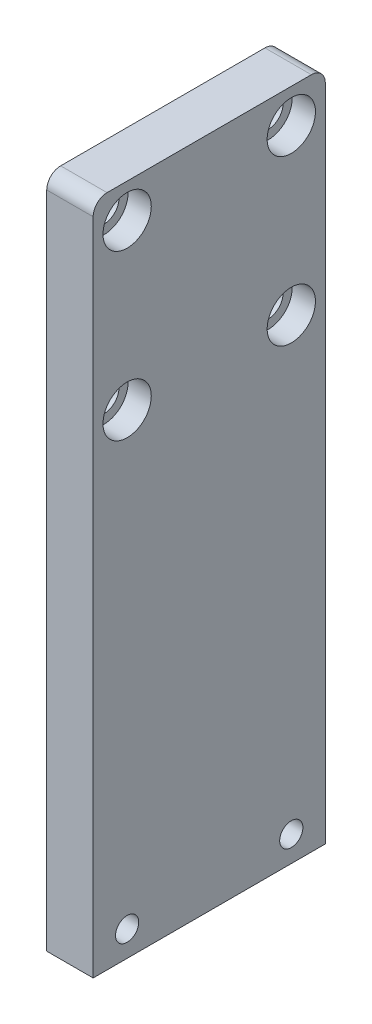
ISO-10303-21;
HEADER;
FILE_DESCRIPTION(('STEP AP214'),'2;1');
FILE_NAME('part.step','',(''),(''),'','','');
FILE_SCHEMA(('AUTOMOTIVE_DESIGN { 1 0 10303 214 1 1 1 1 }'));
ENDSEC;
DATA;
#1=APPLICATION_CONTEXT('core data for automotive mechanical design processes');
#2=APPLICATION_PROTOCOL_DEFINITION('international standard','automotive_design',2000,#1);
#3=PRODUCT_CONTEXT('',#1,'mechanical');
#4=PRODUCT('Part','Part','',(#3));
#5=PRODUCT_RELATED_PRODUCT_CATEGORY('part','',(#4));
#6=PRODUCT_DEFINITION_FORMATION('','',#4);
#7=PRODUCT_DEFINITION_CONTEXT('part definition',#1,'design');
#8=PRODUCT_DEFINITION('design','',#6,#7);
#9=PRODUCT_DEFINITION_SHAPE('','',#8);
#10=(LENGTH_UNIT() NAMED_UNIT(*) SI_UNIT(.MILLI.,.METRE.));
#11=(NAMED_UNIT(*) PLANE_ANGLE_UNIT() SI_UNIT($,.RADIAN.));
#12=(NAMED_UNIT(*) SI_UNIT($,.STERADIAN.) SOLID_ANGLE_UNIT());
#13=UNCERTAINTY_MEASURE_WITH_UNIT(LENGTH_MEASURE(1.E-05),#10,'distance_accuracy_value','');
#14=(GEOMETRIC_REPRESENTATION_CONTEXT(3) GLOBAL_UNCERTAINTY_ASSIGNED_CONTEXT((#13)) GLOBAL_UNIT_ASSIGNED_CONTEXT((#10,
#11,#12)) REPRESENTATION_CONTEXT('',''));
#15=CARTESIAN_POINT('',(0.,0.,0.));
#16=DIRECTION('',(0.,0.,1.));
#17=DIRECTION('',(1.,0.,0.));
#18=AXIS2_PLACEMENT_3D('',#15,#16,#17);
#19=CARTESIAN_POINT('',(10.,-114.5,17.68));
#20=DIRECTION('',(-1.,0.,0.));
#21=DIRECTION('',(0.,0.,1.));
#22=AXIS2_PLACEMENT_3D('',#19,#20,#21);
#23=CYLINDRICAL_SURFACE('',#22,2.5);
#24=CARTESIAN_POINT('',(10.,-114.5,17.68));
#25=DIRECTION('',(1.,0.,0.));
#26=DIRECTION('',(0.,0.,-1.));
#27=AXIS2_PLACEMENT_3D('',#24,#25,#26);
#28=CIRCLE('',#27,2.5);
#29=CARTESIAN_POINT('',(10.,-114.5,15.18));
#30=VERTEX_POINT('',#29);
#31=EDGE_CURVE('E300',#30,#30,#28,.T.);
#32=ORIENTED_EDGE('',*,*,#31,.T.);
#33=EDGE_LOOP('',(#32));
#34=FACE_BOUND('',#33,.T.);
#35=CARTESIAN_POINT('',(5.,-114.5,17.68));
#36=DIRECTION('',(-1.,0.,0.));
#37=DIRECTION('',(0.,0.,1.));
#38=AXIS2_PLACEMENT_3D('',#35,#36,#37);
#39=CIRCLE('',#38,2.5);
#40=CARTESIAN_POINT('',(5.,-114.5,20.18));
#41=VERTEX_POINT('',#40);
#42=EDGE_CURVE('E51',#41,#41,#39,.T.);
#43=ORIENTED_EDGE('',*,*,#42,.T.);
#44=EDGE_LOOP('',(#43));
#45=FACE_BOUND('',#44,.T.);
#46=ADVANCED_FACE('F47',(#34,#45),#23,.F.);
#47=CARTESIAN_POINT('',(10.,17.68,17.68));
#48=DIRECTION('',(-1.,0.,0.));
#49=DIRECTION('',(0.,0.,1.));
#50=AXIS2_PLACEMENT_3D('',#47,#48,#49);
#51=CYLINDRICAL_SURFACE('',#50,3.25);
#52=CARTESIAN_POINT('',(0.,17.68,17.68));
#53=DIRECTION('',(1.,0.,0.));
#54=DIRECTION('',(0.,0.,-1.));
#55=AXIS2_PLACEMENT_3D('',#52,#53,#54);
#56=CIRCLE('',#55,3.25);
#57=CARTESIAN_POINT('',(0.,17.68,14.43));
#58=VERTEX_POINT('',#57);
#59=EDGE_CURVE('E192',#58,#58,#56,.T.);
#60=ORIENTED_EDGE('',*,*,#59,.F.);
#61=EDGE_LOOP('',(#60));
#62=FACE_BOUND('',#61,.T.);
#63=CARTESIAN_POINT('',(5.,17.68,17.68));
#64=DIRECTION('',(1.,0.,0.));
#65=DIRECTION('',(0.,0.,-1.));
#66=AXIS2_PLACEMENT_3D('',#63,#64,#65);
#67=CIRCLE('',#66,3.25);
#68=CARTESIAN_POINT('',(5.,17.68,14.43));
#69=VERTEX_POINT('',#68);
#70=EDGE_CURVE('E217',#69,#69,#67,.T.);
#71=ORIENTED_EDGE('',*,*,#70,.T.);
#72=EDGE_LOOP('',(#71));
#73=FACE_BOUND('',#72,.T.);
#74=ADVANCED_FACE('F348',(#62,#73),#51,.F.);
#75=CARTESIAN_POINT('',(10.,17.68,-17.68));
#76=DIRECTION('',(-1.,0.,0.));
#77=DIRECTION('',(0.,0.,1.));
#78=AXIS2_PLACEMENT_3D('',#75,#76,#77);
#79=CYLINDRICAL_SURFACE('',#78,3.25);
#80=CARTESIAN_POINT('',(0.,17.68,-17.68));
#81=DIRECTION('',(1.,0.,0.));
#82=DIRECTION('',(0.,0.,1.));
#83=AXIS2_PLACEMENT_3D('',#80,#81,#82);
#84=CIRCLE('',#83,3.25);
#85=CARTESIAN_POINT('',(0.,17.68,-14.43));
#86=VERTEX_POINT('',#85);
#87=EDGE_CURVE('E312',#86,#86,#84,.T.);
#88=ORIENTED_EDGE('',*,*,#87,.F.);
#89=EDGE_LOOP('',(#88));
#90=FACE_BOUND('',#89,.T.);
#91=CARTESIAN_POINT('',(5.,17.68,-17.68));
#92=DIRECTION('',(1.,0.,0.));
#93=DIRECTION('',(0.,0.,-1.));
#94=AXIS2_PLACEMENT_3D('',#91,#92,#93);
#95=CIRCLE('',#94,3.25);
#96=CARTESIAN_POINT('',(5.,17.68,-20.93));
#97=VERTEX_POINT('',#96);
#98=EDGE_CURVE('E213',#97,#97,#95,.T.);
#99=ORIENTED_EDGE('',*,*,#98,.T.);
#100=EDGE_LOOP('',(#99));
#101=FACE_BOUND('',#100,.T.);
#102=ADVANCED_FACE('F354',(#90,#101),#79,.F.);
#103=CARTESIAN_POINT('',(10.,-17.68,-17.68));
#104=DIRECTION('',(-1.,0.,0.));
#105=DIRECTION('',(0.,0.,1.));
#106=AXIS2_PLACEMENT_3D('',#103,#104,#105);
#107=CYLINDRICAL_SURFACE('',#106,3.25);
#108=CARTESIAN_POINT('',(0.,-17.68,-17.68));
#109=DIRECTION('',(1.,0.,0.));
#110=DIRECTION('',(0.,0.,-1.));
#111=AXIS2_PLACEMENT_3D('',#108,#109,#110);
#112=CIRCLE('',#111,3.25);
#113=CARTESIAN_POINT('',(0.,-17.68,-20.93));
#114=VERTEX_POINT('',#113);
#115=EDGE_CURVE('E308',#114,#114,#112,.T.);
#116=ORIENTED_EDGE('',*,*,#115,.F.);
#117=EDGE_LOOP('',(#116));
#118=FACE_BOUND('',#117,.T.);
#119=CARTESIAN_POINT('',(5.,-17.68,-17.68));
#120=DIRECTION('',(1.,0.,0.));
#121=DIRECTION('',(0.,0.,-1.));
#122=AXIS2_PLACEMENT_3D('',#119,#120,#121);
#123=CIRCLE('',#122,3.25);
#124=CARTESIAN_POINT('',(5.,-17.68,-20.93));
#125=VERTEX_POINT('',#124);
#126=EDGE_CURVE('E208',#125,#125,#123,.T.);
#127=ORIENTED_EDGE('',*,*,#126,.T.);
#128=EDGE_LOOP('',(#127));
#129=FACE_BOUND('',#128,.T.);
#130=ADVANCED_FACE('F363',(#118,#129),#107,.F.);
#131=CARTESIAN_POINT('',(10.,-17.68,17.68));
#132=DIRECTION('',(-1.,0.,0.));
#133=DIRECTION('',(0.,0.,1.));
#134=AXIS2_PLACEMENT_3D('',#131,#132,#133);
#135=CYLINDRICAL_SURFACE('',#134,3.25);
#136=CARTESIAN_POINT('',(0.,-17.68,17.68));
#137=DIRECTION('',(1.,0.,0.));
#138=DIRECTION('',(0.,0.,1.));
#139=AXIS2_PLACEMENT_3D('',#136,#137,#138);
#140=CIRCLE('',#139,3.25);
#141=CARTESIAN_POINT('',(0.,-17.68,20.93));
#142=VERTEX_POINT('',#141);
#143=EDGE_CURVE('E304',#142,#142,#140,.T.);
#144=ORIENTED_EDGE('',*,*,#143,.F.);
#145=EDGE_LOOP('',(#144));
#146=FACE_BOUND('',#145,.T.);
#147=CARTESIAN_POINT('',(5.,-17.68,17.68));
#148=DIRECTION('',(1.,0.,0.));
#149=DIRECTION('',(0.,0.,-1.));
#150=AXIS2_PLACEMENT_3D('',#147,#148,#149);
#151=CIRCLE('',#150,3.25);
#152=CARTESIAN_POINT('',(5.,-17.68,14.43));
#153=VERTEX_POINT('',#152);
#154=EDGE_CURVE('E204',#153,#153,#151,.T.);
#155=ORIENTED_EDGE('',*,*,#154,.T.);
#156=EDGE_LOOP('',(#155));
#157=FACE_BOUND('',#156,.T.);
#158=ADVANCED_FACE('F360',(#146,#157),#135,.F.);
#159=CARTESIAN_POINT('',(10.,0.,0.));
#160=DIRECTION('',(1.,0.,0.));
#161=DIRECTION('',(0.,0.,-1.));
#162=AXIS2_PLACEMENT_3D('',#159,#160,#161);
#163=PLANE('',#162);
#164=CARTESIAN_POINT('',(10.,-17.68,-17.68));
#165=DIRECTION('',(1.,0.,0.));
#166=DIRECTION('',(0.,0.,-1.));
#167=AXIS2_PLACEMENT_3D('',#164,#165,#166);
#168=CIRCLE('',#167,5.2);
#169=CARTESIAN_POINT('',(10.,-17.68,-22.88));
#170=VERTEX_POINT('',#169);
#171=EDGE_CURVE('E248',#170,#170,#168,.T.);
#172=ORIENTED_EDGE('',*,*,#171,.F.);
#173=EDGE_LOOP('',(#172));
#174=FACE_BOUND('',#173,.T.);
#175=CARTESIAN_POINT('',(10.,-17.68,17.68));
#176=DIRECTION('',(1.,0.,0.));
#177=DIRECTION('',(0.,0.,-1.));
#178=AXIS2_PLACEMENT_3D('',#175,#176,#177);
#179=CIRCLE('',#178,5.2);
#180=CARTESIAN_POINT('',(10.,-17.68,12.48));
#181=VERTEX_POINT('',#180);
#182=EDGE_CURVE('E280',#181,#181,#179,.T.);
#183=ORIENTED_EDGE('',*,*,#182,.F.);
#184=EDGE_LOOP('',(#183));
#185=FACE_BOUND('',#184,.T.);
#186=CARTESIAN_POINT('',(10.,17.68,17.68));
#187=DIRECTION('',(1.,0.,0.));
#188=DIRECTION('',(0.,0.,-1.));
#189=AXIS2_PLACEMENT_3D('',#186,#187,#188);
#190=CIRCLE('',#189,5.2);
#191=CARTESIAN_POINT('',(10.,17.68,12.48));
#192=VERTEX_POINT('',#191);
#193=EDGE_CURVE('E272',#192,#192,#190,.T.);
#194=ORIENTED_EDGE('',*,*,#193,.F.);
#195=EDGE_LOOP('',(#194));
#196=FACE_BOUND('',#195,.T.);
#197=CARTESIAN_POINT('',(10.,17.68,-17.68));
#198=DIRECTION('',(1.,0.,0.));
#199=DIRECTION('',(0.,0.,-1.));
#200=AXIS2_PLACEMENT_3D('',#197,#198,#199);
#201=CIRCLE('',#200,5.2);
#202=CARTESIAN_POINT('',(10.,17.68,-22.88));
#203=VERTEX_POINT('',#202);
#204=EDGE_CURVE('E271',#203,#203,#201,.T.);
#205=ORIENTED_EDGE('',*,*,#204,.F.);
#206=EDGE_LOOP('',(#205));
#207=FACE_BOUND('',#206,.T.);
#208=ORIENTED_EDGE('',*,*,#31,.F.);
#209=EDGE_LOOP('',(#208));
#210=FACE_BOUND('',#209,.T.);
#211=DIRECTION('',(0.,1.,0.));
#212=VECTOR('',#211,1.);
#213=CARTESIAN_POINT('',(10.,-120.,-25.));
#214=LINE('',#213,#212);
#215=CARTESIAN_POINT('',(10.,-120.,-25.));
#216=VERTEX_POINT('',#215);
#217=CARTESIAN_POINT('',(10.,22.,-25.));
#218=VERTEX_POINT('',#217);
#219=EDGE_CURVE('E132',#216,#218,#214,.T.);
#220=ORIENTED_EDGE('',*,*,#219,.T.);
#221=CARTESIAN_POINT('',(10.,22.,-22.));
#222=DIRECTION('',(1.,0.,0.));
#223=DIRECTION('',(0.,0.,-1.));
#224=AXIS2_PLACEMENT_3D('',#221,#222,#223);
#225=CIRCLE('',#224,3.);
#226=CARTESIAN_POINT('',(10.,25.,-22.));
#227=VERTEX_POINT('',#226);
#228=EDGE_CURVE('E57',#218,#227,#225,.T.);
#229=ORIENTED_EDGE('',*,*,#228,.T.);
#230=DIRECTION('',(0.,0.,1.));
#231=VECTOR('',#230,1.);
#232=CARTESIAN_POINT('',(10.,25.,25.));
#233=LINE('',#232,#231);
#234=CARTESIAN_POINT('',(10.,25.,22.));
#235=VERTEX_POINT('',#234);
#236=EDGE_CURVE('E116',#227,#235,#233,.T.);
#237=ORIENTED_EDGE('',*,*,#236,.T.);
#238=CARTESIAN_POINT('',(10.,22.,22.));
#239=DIRECTION('',(1.,0.,0.));
#240=DIRECTION('',(0.,0.,-1.));
#241=AXIS2_PLACEMENT_3D('',#238,#239,#240);
#242=CIRCLE('',#241,3.);
#243=CARTESIAN_POINT('',(10.,22.,25.));
#244=VERTEX_POINT('',#243);
#245=EDGE_CURVE('E65',#235,#244,#242,.T.);
#246=ORIENTED_EDGE('',*,*,#245,.T.);
#247=DIRECTION('',(0.,-1.,0.));
#248=VECTOR('',#247,1.);
#249=CARTESIAN_POINT('',(10.,0.,25.));
#250=LINE('',#249,#248);
#251=CARTESIAN_POINT('',(10.,-120.,25.));
#252=VERTEX_POINT('',#251);
#253=EDGE_CURVE('E106',#244,#252,#250,.T.);
#254=ORIENTED_EDGE('',*,*,#253,.T.);
#255=DIRECTION('',(0.,0.,-1.));
#256=VECTOR('',#255,1.);
#257=CARTESIAN_POINT('',(10.,-120.,25.));
#258=LINE('',#257,#256);
#259=EDGE_CURVE('E111',#252,#216,#258,.T.);
#260=ORIENTED_EDGE('',*,*,#259,.T.);
#261=EDGE_LOOP('',(#220,#229,#237,#246,#254,#260));
#262=FACE_BOUND('',#261,.T.);
#263=CARTESIAN_POINT('',(10.,-114.5,-17.68));
#264=DIRECTION('',(1.,0.,0.));
#265=DIRECTION('',(0.,0.,1.));
#266=AXIS2_PLACEMENT_3D('',#263,#264,#265);
#267=CIRCLE('',#266,2.5);
#268=CARTESIAN_POINT('',(10.,-114.5,-15.18));
#269=VERTEX_POINT('',#268);
#270=EDGE_CURVE('E221',#269,#269,#267,.T.);
#271=ORIENTED_EDGE('',*,*,#270,.F.);
#272=EDGE_LOOP('',(#271));
#273=FACE_BOUND('',#272,.T.);
#274=ADVANCED_FACE('F108',(#174,#185,#196,#207,#210,#262,#273),#163,.T.);
#275=CARTESIAN_POINT('',(0.,0.,0.));
#276=DIRECTION('',(1.,0.,0.));
#277=DIRECTION('',(0.,0.,-1.));
#278=AXIS2_PLACEMENT_3D('',#275,#276,#277);
#279=PLANE('',#278);
#280=CARTESIAN_POINT('',(0.,-114.5,17.68));
#281=DIRECTION('',(-1.,0.,0.));
#282=DIRECTION('',(0.,0.,1.));
#283=AXIS2_PLACEMENT_3D('',#280,#281,#282);
#284=CIRCLE('',#283,4.425);
#285=CARTESIAN_POINT('',(0.,-114.5,22.105));
#286=VERTEX_POINT('',#285);
#287=EDGE_CURVE('E250',#286,#286,#284,.T.);
#288=ORIENTED_EDGE('',*,*,#287,.F.);
#289=EDGE_LOOP('',(#288));
#290=FACE_BOUND('',#289,.T.);
#291=CARTESIAN_POINT('',(0.,-114.5,-17.68));
#292=DIRECTION('',(-1.,0.,0.));
#293=DIRECTION('',(0.,0.,-1.));
#294=AXIS2_PLACEMENT_3D('',#291,#292,#293);
#295=CIRCLE('',#294,4.425);
#296=CARTESIAN_POINT('',(0.,-114.5,-22.105));
#297=VERTEX_POINT('',#296);
#298=EDGE_CURVE('E263',#297,#297,#295,.T.);
#299=ORIENTED_EDGE('',*,*,#298,.F.);
#300=EDGE_LOOP('',(#299));
#301=FACE_BOUND('',#300,.T.);
#302=DIRECTION('',(0.,0.,1.));
#303=VECTOR('',#302,1.);
#304=CARTESIAN_POINT('',(0.,25.,0.));
#305=LINE('',#304,#303);
#306=CARTESIAN_POINT('',(0.,25.,-22.));
#307=VERTEX_POINT('',#306);
#308=CARTESIAN_POINT('',(0.,25.,22.));
#309=VERTEX_POINT('',#308);
#310=EDGE_CURVE('E198',#307,#309,#305,.T.);
#311=ORIENTED_EDGE('',*,*,#310,.F.);
#312=CARTESIAN_POINT('',(0.,22.,-22.));
#313=DIRECTION('',(1.,0.,0.));
#314=DIRECTION('',(0.,0.,-1.));
#315=AXIS2_PLACEMENT_3D('',#312,#313,#314);
#316=CIRCLE('',#315,3.);
#317=CARTESIAN_POINT('',(0.,22.,-25.));
#318=VERTEX_POINT('',#317);
#319=EDGE_CURVE('E231',#307,#318,#316,.F.);
#320=ORIENTED_EDGE('',*,*,#319,.T.);
#321=DIRECTION('',(0.,1.,0.));
#322=VECTOR('',#321,1.);
#323=CARTESIAN_POINT('',(0.,-120.,-25.));
#324=LINE('',#323,#322);
#325=CARTESIAN_POINT('',(0.,-120.,-25.));
#326=VERTEX_POINT('',#325);
#327=EDGE_CURVE('E195',#326,#318,#324,.T.);
#328=ORIENTED_EDGE('',*,*,#327,.F.);
#329=DIRECTION('',(0.,0.,-1.));
#330=VECTOR('',#329,1.);
#331=CARTESIAN_POINT('',(0.,-120.,25.));
#332=LINE('',#331,#330);
#333=CARTESIAN_POINT('',(0.,-120.,25.));
#334=VERTEX_POINT('',#333);
#335=EDGE_CURVE('E191',#334,#326,#332,.T.);
#336=ORIENTED_EDGE('',*,*,#335,.F.);
#337=DIRECTION('',(0.,-1.,0.));
#338=VECTOR('',#337,1.);
#339=CARTESIAN_POINT('',(0.,0.,25.));
#340=LINE('',#339,#338);
#341=CARTESIAN_POINT('',(0.,22.,25.));
#342=VERTEX_POINT('',#341);
#343=EDGE_CURVE('E122',#342,#334,#340,.T.);
#344=ORIENTED_EDGE('',*,*,#343,.F.);
#345=CARTESIAN_POINT('',(0.,22.,22.));
#346=DIRECTION('',(1.,0.,0.));
#347=DIRECTION('',(0.,0.,-1.));
#348=AXIS2_PLACEMENT_3D('',#345,#346,#347);
#349=CIRCLE('',#348,3.);
#350=EDGE_CURVE('E228',#342,#309,#349,.F.);
#351=ORIENTED_EDGE('',*,*,#350,.T.);
#352=EDGE_LOOP('',(#311,#320,#328,#336,#344,#351));
#353=FACE_BOUND('',#352,.T.);
#354=ORIENTED_EDGE('',*,*,#59,.T.);
#355=EDGE_LOOP('',(#354));
#356=FACE_BOUND('',#355,.T.);
#357=ORIENTED_EDGE('',*,*,#87,.T.);
#358=EDGE_LOOP('',(#357));
#359=FACE_BOUND('',#358,.T.);
#360=ORIENTED_EDGE('',*,*,#115,.T.);
#361=EDGE_LOOP('',(#360));
#362=FACE_BOUND('',#361,.T.);
#363=ORIENTED_EDGE('',*,*,#143,.T.);
#364=EDGE_LOOP('',(#363));
#365=FACE_BOUND('',#364,.T.);
#366=ADVANCED_FACE('F328',(#290,#301,#353,#356,#359,#362,#365),#279,.F.);
#367=CARTESIAN_POINT('',(10.,0.,25.));
#368=DIRECTION('',(0.,0.,-1.));
#369=DIRECTION('',(0.,1.,0.));
#370=AXIS2_PLACEMENT_3D('',#367,#368,#369);
#371=PLANE('',#370);
#372=ORIENTED_EDGE('',*,*,#253,.F.);
#373=DIRECTION('',(-1.,0.,0.));
#374=VECTOR('',#373,1.);
#375=CARTESIAN_POINT('',(10.,22.,25.));
#376=LINE('',#375,#374);
#377=EDGE_CURVE('E12',#244,#342,#376,.T.);
#378=ORIENTED_EDGE('',*,*,#377,.T.);
#379=ORIENTED_EDGE('',*,*,#343,.T.);
#380=DIRECTION('',(-1.,0.,0.));
#381=VECTOR('',#380,1.);
#382=CARTESIAN_POINT('',(10.,-120.,25.));
#383=LINE('',#382,#381);
#384=EDGE_CURVE('E119',#252,#334,#383,.T.);
#385=ORIENTED_EDGE('',*,*,#384,.F.);
#386=EDGE_LOOP('',(#372,#378,#379,#385));
#387=FACE_BOUND('',#386,.T.);
#388=ADVANCED_FACE('F120',(#387),#371,.F.);
#389=CARTESIAN_POINT('',(10.,-120.,25.));
#390=DIRECTION('',(0.,1.,0.));
#391=DIRECTION('',(0.,0.,1.));
#392=AXIS2_PLACEMENT_3D('',#389,#390,#391);
#393=PLANE('',#392);
#394=ORIENTED_EDGE('',*,*,#335,.T.);
#395=DIRECTION('',(-1.,0.,0.));
#396=VECTOR('',#395,1.);
#397=CARTESIAN_POINT('',(10.,-120.,-25.));
#398=LINE('',#397,#396);
#399=EDGE_CURVE('E127',#216,#326,#398,.T.);
#400=ORIENTED_EDGE('',*,*,#399,.F.);
#401=ORIENTED_EDGE('',*,*,#259,.F.);
#402=ORIENTED_EDGE('',*,*,#384,.T.);
#403=EDGE_LOOP('',(#394,#400,#401,#402));
#404=FACE_BOUND('',#403,.T.);
#405=ADVANCED_FACE('F129',(#404),#393,.F.);
#406=CARTESIAN_POINT('',(10.,-120.,-25.));
#407=DIRECTION('',(0.,0.,1.));
#408=DIRECTION('',(0.,-1.,0.));
#409=AXIS2_PLACEMENT_3D('',#406,#407,#408);
#410=PLANE('',#409);
#411=ORIENTED_EDGE('',*,*,#327,.T.);
#412=DIRECTION('',(-1.,0.,0.));
#413=VECTOR('',#412,1.);
#414=CARTESIAN_POINT('',(10.,22.,-25.));
#415=LINE('',#414,#413);
#416=EDGE_CURVE('E73',#318,#218,#415,.F.);
#417=ORIENTED_EDGE('',*,*,#416,.T.);
#418=ORIENTED_EDGE('',*,*,#219,.F.);
#419=ORIENTED_EDGE('',*,*,#399,.T.);
#420=EDGE_LOOP('',(#411,#417,#418,#419));
#421=FACE_BOUND('',#420,.T.);
#422=ADVANCED_FACE('F331',(#421),#410,.F.);
#423=CARTESIAN_POINT('',(10.,25.,0.));
#424=DIRECTION('',(0.,-1.,0.));
#425=DIRECTION('',(0.,0.,-1.));
#426=AXIS2_PLACEMENT_3D('',#423,#424,#425);
#427=PLANE('',#426);
#428=ORIENTED_EDGE('',*,*,#236,.F.);
#429=DIRECTION('',(-1.,0.,0.));
#430=VECTOR('',#429,1.);
#431=CARTESIAN_POINT('',(10.,25.,-22.));
#432=LINE('',#431,#430);
#433=EDGE_CURVE('E224',#227,#307,#432,.T.);
#434=ORIENTED_EDGE('',*,*,#433,.T.);
#435=ORIENTED_EDGE('',*,*,#310,.T.);
#436=DIRECTION('',(-1.,0.,0.));
#437=VECTOR('',#436,1.);
#438=CARTESIAN_POINT('',(10.,25.,22.));
#439=LINE('',#438,#437);
#440=EDGE_CURVE('E126',#309,#235,#439,.F.);
#441=ORIENTED_EDGE('',*,*,#440,.T.);
#442=EDGE_LOOP('',(#428,#434,#435,#441));
#443=FACE_BOUND('',#442,.T.);
#444=ADVANCED_FACE('F334',(#443),#427,.F.);
#445=CARTESIAN_POINT('',(10.,-114.5,-17.68));
#446=DIRECTION('',(-1.,0.,0.));
#447=DIRECTION('',(0.,0.,1.));
#448=AXIS2_PLACEMENT_3D('',#445,#446,#447);
#449=CYLINDRICAL_SURFACE('',#448,2.5);
#450=CARTESIAN_POINT('',(5.,-114.5,-17.68));
#451=DIRECTION('',(1.,0.,0.));
#452=DIRECTION('',(0.,0.,-1.));
#453=AXIS2_PLACEMENT_3D('',#450,#451,#452);
#454=CIRCLE('',#453,2.5);
#455=CARTESIAN_POINT('',(5.,-114.5,-20.18));
#456=VERTEX_POINT('',#455);
#457=EDGE_CURVE('E239',#456,#456,#454,.T.);
#458=ORIENTED_EDGE('',*,*,#457,.F.);
#459=EDGE_LOOP('',(#458));
#460=FACE_BOUND('',#459,.T.);
#461=ORIENTED_EDGE('',*,*,#270,.T.);
#462=EDGE_LOOP('',(#461));
#463=FACE_BOUND('',#462,.T.);
#464=ADVANCED_FACE('F336',(#460,#463),#449,.F.);
#465=CARTESIAN_POINT('',(5.,-17.68,17.68));
#466=DIRECTION('',(1.,0.,0.));
#467=DIRECTION('',(0.,0.,-1.));
#468=AXIS2_PLACEMENT_3D('',#465,#466,#467);
#469=CYLINDRICAL_SURFACE('',#468,5.2);
#470=CARTESIAN_POINT('',(5.,-17.68,17.68));
#471=DIRECTION('',(1.,0.,0.));
#472=DIRECTION('',(0.,0.,-1.));
#473=AXIS2_PLACEMENT_3D('',#470,#471,#472);
#474=CIRCLE('',#473,5.2);
#475=CARTESIAN_POINT('',(5.,-17.68,12.48));
#476=VERTEX_POINT('',#475);
#477=EDGE_CURVE('E276',#476,#476,#474,.T.);
#478=ORIENTED_EDGE('',*,*,#477,.F.);
#479=EDGE_LOOP('',(#478));
#480=FACE_BOUND('',#479,.T.);
#481=ORIENTED_EDGE('',*,*,#182,.T.);
#482=EDGE_LOOP('',(#481));
#483=FACE_BOUND('',#482,.T.);
#484=ADVANCED_FACE('F342',(#480,#483),#469,.F.);
#485=CARTESIAN_POINT('',(5.,-17.68,17.68));
#486=DIRECTION('',(1.,0.,0.));
#487=DIRECTION('',(0.,0.,-1.));
#488=AXIS2_PLACEMENT_3D('',#485,#486,#487);
#489=PLANE('',#488);
#490=ORIENTED_EDGE('',*,*,#154,.F.);
#491=EDGE_LOOP('',(#490));
#492=FACE_BOUND('',#491,.T.);
#493=ORIENTED_EDGE('',*,*,#477,.T.);
#494=EDGE_LOOP('',(#493));
#495=FACE_BOUND('',#494,.T.);
#496=ADVANCED_FACE('F406',(#492,#495),#489,.T.);
#497=CARTESIAN_POINT('',(5.,-17.68,-17.68));
#498=DIRECTION('',(1.,0.,0.));
#499=DIRECTION('',(0.,0.,-1.));
#500=AXIS2_PLACEMENT_3D('',#497,#498,#499);
#501=CYLINDRICAL_SURFACE('',#500,5.2);
#502=CARTESIAN_POINT('',(5.,-17.68,-17.68));
#503=DIRECTION('',(1.,0.,0.));
#504=DIRECTION('',(0.,0.,-1.));
#505=AXIS2_PLACEMENT_3D('',#502,#503,#504);
#506=CIRCLE('',#505,5.2);
#507=CARTESIAN_POINT('',(5.,-17.68,-22.88));
#508=VERTEX_POINT('',#507);
#509=EDGE_CURVE('E284',#508,#508,#506,.T.);
#510=ORIENTED_EDGE('',*,*,#509,.F.);
#511=EDGE_LOOP('',(#510));
#512=FACE_BOUND('',#511,.T.);
#513=ORIENTED_EDGE('',*,*,#171,.T.);
#514=EDGE_LOOP('',(#513));
#515=FACE_BOUND('',#514,.T.);
#516=ADVANCED_FACE('F409',(#512,#515),#501,.F.);
#517=CARTESIAN_POINT('',(5.,-17.68,-17.68));
#518=DIRECTION('',(1.,0.,0.));
#519=DIRECTION('',(0.,0.,-1.));
#520=AXIS2_PLACEMENT_3D('',#517,#518,#519);
#521=PLANE('',#520);
#522=ORIENTED_EDGE('',*,*,#126,.F.);
#523=EDGE_LOOP('',(#522));
#524=FACE_BOUND('',#523,.T.);
#525=ORIENTED_EDGE('',*,*,#509,.T.);
#526=EDGE_LOOP('',(#525));
#527=FACE_BOUND('',#526,.T.);
#528=ADVANCED_FACE('F414',(#524,#527),#521,.T.);
#529=CARTESIAN_POINT('',(5.,17.68,-17.68));
#530=DIRECTION('',(1.,0.,0.));
#531=DIRECTION('',(0.,0.,-1.));
#532=AXIS2_PLACEMENT_3D('',#529,#530,#531);
#533=CYLINDRICAL_SURFACE('',#532,5.2);
#534=CARTESIAN_POINT('',(5.,17.68,-17.68));
#535=DIRECTION('',(1.,0.,0.));
#536=DIRECTION('',(0.,0.,-1.));
#537=AXIS2_PLACEMENT_3D('',#534,#535,#536);
#538=CIRCLE('',#537,5.2);
#539=CARTESIAN_POINT('',(5.,17.68,-22.88));
#540=VERTEX_POINT('',#539);
#541=EDGE_CURVE('E209',#540,#540,#538,.T.);
#542=ORIENTED_EDGE('',*,*,#541,.F.);
#543=EDGE_LOOP('',(#542));
#544=FACE_BOUND('',#543,.T.);
#545=ORIENTED_EDGE('',*,*,#204,.T.);
#546=EDGE_LOOP('',(#545));
#547=FACE_BOUND('',#546,.T.);
#548=ADVANCED_FACE('F417',(#544,#547),#533,.F.);
#549=CARTESIAN_POINT('',(5.,17.68,-17.68));
#550=DIRECTION('',(1.,0.,0.));
#551=DIRECTION('',(0.,0.,-1.));
#552=AXIS2_PLACEMENT_3D('',#549,#550,#551);
#553=PLANE('',#552);
#554=ORIENTED_EDGE('',*,*,#98,.F.);
#555=EDGE_LOOP('',(#554));
#556=FACE_BOUND('',#555,.T.);
#557=ORIENTED_EDGE('',*,*,#541,.T.);
#558=EDGE_LOOP('',(#557));
#559=FACE_BOUND('',#558,.T.);
#560=ADVANCED_FACE('F404',(#556,#559),#553,.T.);
#561=CARTESIAN_POINT('',(5.,17.68,17.68));
#562=DIRECTION('',(1.,0.,0.));
#563=DIRECTION('',(0.,0.,-1.));
#564=AXIS2_PLACEMENT_3D('',#561,#562,#563);
#565=CYLINDRICAL_SURFACE('',#564,5.2);
#566=CARTESIAN_POINT('',(5.,17.68,17.68));
#567=DIRECTION('',(1.,0.,0.));
#568=DIRECTION('',(0.,0.,-1.));
#569=AXIS2_PLACEMENT_3D('',#566,#567,#568);
#570=CIRCLE('',#569,5.2);
#571=CARTESIAN_POINT('',(5.,17.68,12.48));
#572=VERTEX_POINT('',#571);
#573=EDGE_CURVE('E267',#572,#572,#570,.T.);
#574=ORIENTED_EDGE('',*,*,#573,.F.);
#575=EDGE_LOOP('',(#574));
#576=FACE_BOUND('',#575,.T.);
#577=ORIENTED_EDGE('',*,*,#193,.T.);
#578=EDGE_LOOP('',(#577));
#579=FACE_BOUND('',#578,.T.);
#580=ADVANCED_FACE('F400',(#576,#579),#565,.F.);
#581=CARTESIAN_POINT('',(5.,17.68,17.68));
#582=DIRECTION('',(1.,0.,0.));
#583=DIRECTION('',(0.,0.,-1.));
#584=AXIS2_PLACEMENT_3D('',#581,#582,#583);
#585=PLANE('',#584);
#586=ORIENTED_EDGE('',*,*,#70,.F.);
#587=EDGE_LOOP('',(#586));
#588=FACE_BOUND('',#587,.T.);
#589=ORIENTED_EDGE('',*,*,#573,.T.);
#590=EDGE_LOOP('',(#589));
#591=FACE_BOUND('',#590,.T.);
#592=ADVANCED_FACE('F397',(#588,#591),#585,.T.);
#593=CARTESIAN_POINT('',(10.,22.,-22.));
#594=DIRECTION('',(-1.,0.,0.));
#595=DIRECTION('',(0.,0.,1.));
#596=AXIS2_PLACEMENT_3D('',#593,#594,#595);
#597=CYLINDRICAL_SURFACE('',#596,3.);
#598=ORIENTED_EDGE('',*,*,#228,.F.);
#599=ORIENTED_EDGE('',*,*,#416,.F.);
#600=ORIENTED_EDGE('',*,*,#319,.F.);
#601=ORIENTED_EDGE('',*,*,#433,.F.);
#602=EDGE_LOOP('',(#598,#599,#600,#601));
#603=FACE_BOUND('',#602,.T.);
#604=ADVANCED_FACE('F333',(#603),#597,.T.);
#605=CARTESIAN_POINT('',(10.,22.,22.));
#606=DIRECTION('',(-1.,0.,0.));
#607=DIRECTION('',(0.,0.,1.));
#608=AXIS2_PLACEMENT_3D('',#605,#606,#607);
#609=CYLINDRICAL_SURFACE('',#608,3.);
#610=ORIENTED_EDGE('',*,*,#245,.F.);
#611=ORIENTED_EDGE('',*,*,#440,.F.);
#612=ORIENTED_EDGE('',*,*,#350,.F.);
#613=ORIENTED_EDGE('',*,*,#377,.F.);
#614=EDGE_LOOP('',(#610,#611,#612,#613));
#615=FACE_BOUND('',#614,.T.);
#616=ADVANCED_FACE('F49',(#615),#609,.T.);
#617=CARTESIAN_POINT('',(5.,-114.5,-17.68));
#618=DIRECTION('',(-1.,0.,0.));
#619=DIRECTION('',(0.,0.,1.));
#620=AXIS2_PLACEMENT_3D('',#617,#618,#619);
#621=CYLINDRICAL_SURFACE('',#620,4.425);
#622=CARTESIAN_POINT('',(5.,-114.5,-17.68));
#623=DIRECTION('',(-1.,0.,0.));
#624=DIRECTION('',(0.,0.,-1.));
#625=AXIS2_PLACEMENT_3D('',#622,#623,#624);
#626=CIRCLE('',#625,4.425);
#627=CARTESIAN_POINT('',(5.,-114.5,-22.105));
#628=VERTEX_POINT('',#627);
#629=EDGE_CURVE('E257',#628,#628,#626,.T.);
#630=ORIENTED_EDGE('',*,*,#629,.F.);
#631=EDGE_LOOP('',(#630));
#632=FACE_BOUND('',#631,.T.);
#633=ORIENTED_EDGE('',*,*,#298,.T.);
#634=EDGE_LOOP('',(#633));
#635=FACE_BOUND('',#634,.T.);
#636=ADVANCED_FACE('F383',(#632,#635),#621,.F.);
#637=CARTESIAN_POINT('',(5.,-114.5,-17.68));
#638=DIRECTION('',(1.,0.,0.));
#639=DIRECTION('',(0.,0.,-1.));
#640=AXIS2_PLACEMENT_3D('',#637,#638,#639);
#641=PLANE('',#640);
#642=ORIENTED_EDGE('',*,*,#457,.T.);
#643=EDGE_LOOP('',(#642));
#644=FACE_BOUND('',#643,.T.);
#645=ORIENTED_EDGE('',*,*,#629,.T.);
#646=EDGE_LOOP('',(#645));
#647=FACE_BOUND('',#646,.T.);
#648=ADVANCED_FACE('F385',(#644,#647),#641,.F.);
#649=CARTESIAN_POINT('',(5.,-114.5,17.68));
#650=DIRECTION('',(-1.,0.,0.));
#651=DIRECTION('',(0.,0.,1.));
#652=AXIS2_PLACEMENT_3D('',#649,#650,#651);
#653=CYLINDRICAL_SURFACE('',#652,4.425);
#654=CARTESIAN_POINT('',(5.,-114.5,17.68));
#655=DIRECTION('',(-1.,0.,0.));
#656=DIRECTION('',(0.,0.,1.));
#657=AXIS2_PLACEMENT_3D('',#654,#655,#656);
#658=CIRCLE('',#657,4.425);
#659=CARTESIAN_POINT('',(5.,-114.5,22.105));
#660=VERTEX_POINT('',#659);
#661=EDGE_CURVE('E242',#660,#660,#658,.T.);
#662=ORIENTED_EDGE('',*,*,#661,.F.);
#663=EDGE_LOOP('',(#662));
#664=FACE_BOUND('',#663,.T.);
#665=ORIENTED_EDGE('',*,*,#287,.T.);
#666=EDGE_LOOP('',(#665));
#667=FACE_BOUND('',#666,.T.);
#668=ADVANCED_FACE('F392',(#664,#667),#653,.F.);
#669=CARTESIAN_POINT('',(5.,-114.5,17.68));
#670=DIRECTION('',(-1.,0.,0.));
#671=DIRECTION('',(0.,0.,1.));
#672=AXIS2_PLACEMENT_3D('',#669,#670,#671);
#673=PLANE('',#672);
#674=ORIENTED_EDGE('',*,*,#42,.F.);
#675=EDGE_LOOP('',(#674));
#676=FACE_BOUND('',#675,.T.);
#677=ORIENTED_EDGE('',*,*,#661,.T.);
#678=EDGE_LOOP('',(#677));
#679=FACE_BOUND('',#678,.T.);
#680=ADVANCED_FACE('F469',(#676,#679),#673,.T.);
#681=CLOSED_SHELL('',(#46,#74,#102,#130,#158,#274,#366,#388,#405,#422,#444,#464,#484,#496,#516,
#528,#548,#560,#580,#592,#604,#616,#636,#648,#668,#680));
#682=MANIFOLD_SOLID_BREP('B2',#681);
#683=ADVANCED_BREP_SHAPE_REPRESENTATION('',(#18,#682),#14);
#684=SHAPE_DEFINITION_REPRESENTATION(#9,#683);
ENDSEC;
END-ISO-10303-21;
